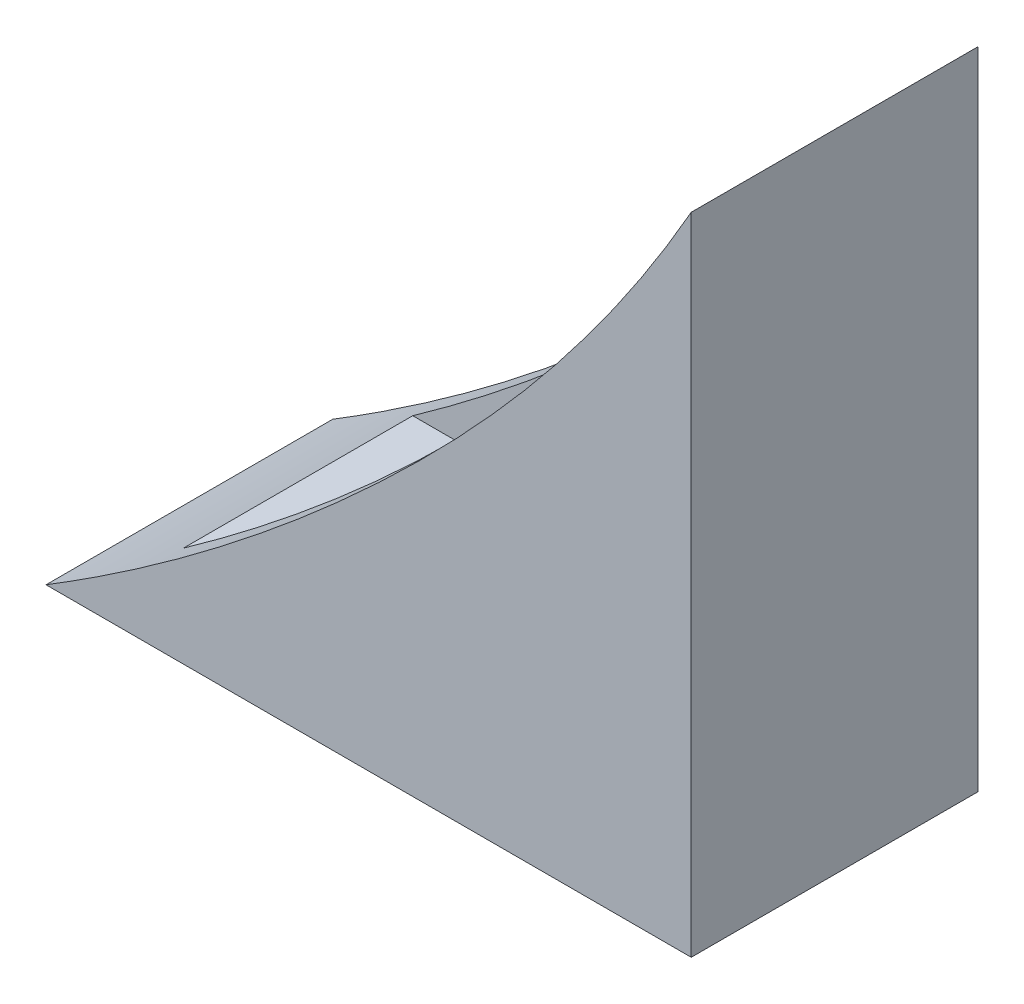
ISO-10303-21;
HEADER;
FILE_DESCRIPTION(('STEP AP214'),'2;1');
FILE_NAME('part.step','',(''),(''),'','','');
FILE_SCHEMA(('AUTOMOTIVE_DESIGN { 1 0 10303 214 1 1 1 1 }'));
ENDSEC;
DATA;
#1=APPLICATION_CONTEXT('core data for automotive mechanical design processes');
#2=APPLICATION_PROTOCOL_DEFINITION('international standard','automotive_design',2000,#1);
#3=PRODUCT_CONTEXT('',#1,'mechanical');
#4=PRODUCT('Part','Part','',(#3));
#5=PRODUCT_RELATED_PRODUCT_CATEGORY('part','',(#4));
#6=PRODUCT_DEFINITION_FORMATION('','',#4);
#7=PRODUCT_DEFINITION_CONTEXT('part definition',#1,'design');
#8=PRODUCT_DEFINITION('design','',#6,#7);
#9=PRODUCT_DEFINITION_SHAPE('','',#8);
#10=(LENGTH_UNIT() NAMED_UNIT(*) SI_UNIT(.MILLI.,.METRE.));
#11=(NAMED_UNIT(*) PLANE_ANGLE_UNIT() SI_UNIT($,.RADIAN.));
#12=(NAMED_UNIT(*) SI_UNIT($,.STERADIAN.) SOLID_ANGLE_UNIT());
#13=UNCERTAINTY_MEASURE_WITH_UNIT(LENGTH_MEASURE(1.E-05),#10,'distance_accuracy_value','');
#14=(GEOMETRIC_REPRESENTATION_CONTEXT(3) GLOBAL_UNCERTAINTY_ASSIGNED_CONTEXT((#13)) GLOBAL_UNIT_ASSIGNED_CONTEXT((#10,
#11,#12)) REPRESENTATION_CONTEXT('',''));
#15=CARTESIAN_POINT('',(0.,0.,0.));
#16=DIRECTION('',(0.,0.,1.));
#17=DIRECTION('',(1.,0.,0.));
#18=AXIS2_PLACEMENT_3D('',#15,#16,#17);
#19=CARTESIAN_POINT('',(-45.,0.,20.));
#20=DIRECTION('',(0.,1.,0.));
#21=DIRECTION('',(0.,0.,1.));
#22=AXIS2_PLACEMENT_3D('',#19,#20,#21);
#23=PLANE('',#22);
#24=DIRECTION('',(1.,0.,0.));
#25=VECTOR('',#24,1.);
#26=CARTESIAN_POINT('',(-45.,0.,0.));
#27=LINE('',#26,#25);
#28=CARTESIAN_POINT('',(-45.,0.,0.));
#29=VERTEX_POINT('',#28);
#30=CARTESIAN_POINT('',(0.,0.,0.));
#31=VERTEX_POINT('',#30);
#32=EDGE_CURVE('E120',#29,#31,#27,.T.);
#33=ORIENTED_EDGE('',*,*,#32,.T.);
#34=DIRECTION('',(0.,0.,-1.));
#35=VECTOR('',#34,1.);
#36=CARTESIAN_POINT('',(0.,0.,20.));
#37=LINE('',#36,#35);
#38=CARTESIAN_POINT('',(0.,0.,20.));
#39=VERTEX_POINT('',#38);
#40=EDGE_CURVE('E151',#39,#31,#37,.T.);
#41=ORIENTED_EDGE('',*,*,#40,.F.);
#42=DIRECTION('',(1.,0.,0.));
#43=VECTOR('',#42,1.);
#44=CARTESIAN_POINT('',(-45.,0.,20.));
#45=LINE('',#44,#43);
#46=CARTESIAN_POINT('',(-45.,0.,20.));
#47=VERTEX_POINT('',#46);
#48=EDGE_CURVE('E122',#47,#39,#45,.T.);
#49=ORIENTED_EDGE('',*,*,#48,.F.);
#50=DIRECTION('',(0.,0.,-1.));
#51=VECTOR('',#50,1.);
#52=CARTESIAN_POINT('',(-45.,0.,20.));
#53=LINE('',#52,#51);
#54=EDGE_CURVE('E129',#47,#29,#53,.T.);
#55=ORIENTED_EDGE('',*,*,#54,.T.);
#56=EDGE_LOOP('',(#33,#41,#49,#55));
#57=FACE_BOUND('',#56,.T.);
#58=ADVANCED_FACE('F35',(#57),#23,.F.);
#59=CARTESIAN_POINT('',(0.,0.,20.));
#60=DIRECTION('',(-1.,0.,0.));
#61=DIRECTION('',(0.,0.,1.));
#62=AXIS2_PLACEMENT_3D('',#59,#60,#61);
#63=PLANE('',#62);
#64=DIRECTION('',(0.,1.,0.));
#65=VECTOR('',#64,1.);
#66=CARTESIAN_POINT('',(0.,0.,0.));
#67=LINE('',#66,#65);
#68=CARTESIAN_POINT('',(0.,45.,0.));
#69=VERTEX_POINT('',#68);
#70=EDGE_CURVE('E148',#31,#69,#67,.T.);
#71=ORIENTED_EDGE('',*,*,#70,.T.);
#72=DIRECTION('',(0.,0.,-1.));
#73=VECTOR('',#72,1.);
#74=CARTESIAN_POINT('',(0.,45.,20.));
#75=LINE('',#74,#73);
#76=CARTESIAN_POINT('',(0.,45.,20.));
#77=VERTEX_POINT('',#76);
#78=EDGE_CURVE('E149',#77,#69,#75,.T.);
#79=ORIENTED_EDGE('',*,*,#78,.F.);
#80=DIRECTION('',(0.,1.,0.));
#81=VECTOR('',#80,1.);
#82=CARTESIAN_POINT('',(0.,0.,20.));
#83=LINE('',#82,#81);
#84=EDGE_CURVE('E83',#39,#77,#83,.T.);
#85=ORIENTED_EDGE('',*,*,#84,.F.);
#86=ORIENTED_EDGE('',*,*,#40,.T.);
#87=EDGE_LOOP('',(#71,#79,#85,#86));
#88=FACE_BOUND('',#87,.T.);
#89=ADVANCED_FACE('F139',(#88),#63,.F.);
#90=CARTESIAN_POINT('',(0.,45.,20.));
#91=CARTESIAN_POINT('',(-6.04309053970218,34.3770329950193,20.));
#92=CARTESIAN_POINT('',(-19.5965553607295,18.2904740966961,20.));
#93=CARTESIAN_POINT('',(-36.7689542137888,5.04759812100556,20.));
#94=CARTESIAN_POINT('',(-45.,0.,20.));
#95=B_SPLINE_CURVE_WITH_KNOTS('',3,(#90,#91,#92,#93,#94),.UNSPECIFIED.,.F.,.F.,(4,1,4),(0.,
0.550000000000001,1.),.UNSPECIFIED.);
#96=DIRECTION('',(0.,0.,-1.));
#97=VECTOR('',#96,1.);
#98=SURFACE_OF_LINEAR_EXTRUSION('',#95,#97);
#99=DIRECTION('',(0.,0.,-1.));
#100=VECTOR('',#99,1.);
#101=CARTESIAN_POINT('',(-4.99999999999907,37.0497521542313,20.));
#102=LINE('',#101,#100);
#103=CARTESIAN_POINT('',(-5.,37.0497521550673,2.));
#104=VERTEX_POINT('',#103);
#105=CARTESIAN_POINT('',(-5.,37.0497521542313,18.));
#106=VERTEX_POINT('',#105);
#107=EDGE_CURVE('E44',#104,#106,#102,.F.);
#108=ORIENTED_EDGE('',*,*,#107,.T.);
#109=CARTESIAN_POINT('',(0.,45.,18.));
#110=CARTESIAN_POINT('',(-6.04309053970218,34.3770329950193,18.));
#111=CARTESIAN_POINT('',(-19.5965553607295,18.2904740966961,18.));
#112=CARTESIAN_POINT('',(-36.7689542137888,5.04759812100556,18.));
#113=CARTESIAN_POINT('',(-45.,0.,18.));
#114=B_SPLINE_CURVE_WITH_KNOTS('',3,(#109,#110,#111,#112,#113),.UNSPECIFIED.,.F.,.F.,(4,1,4),
(0.,0.550000000000001,1.),.UNSPECIFIED.);
#115=CARTESIAN_POINT('',(-37.4223086144404,5.,18.));
#116=VERTEX_POINT('',#115);
#117=EDGE_CURVE('E11',#106,#116,#114,.T.);
#118=ORIENTED_EDGE('',*,*,#117,.T.);
#119=DIRECTION('',(0.,0.,-1.));
#120=VECTOR('',#119,1.);
#121=CARTESIAN_POINT('',(-37.4223086144404,5.,20.));
#122=LINE('',#121,#120);
#123=CARTESIAN_POINT('',(-37.4223086144404,5.,2.));
#124=VERTEX_POINT('',#123);
#125=EDGE_CURVE('E165',#124,#116,#122,.F.);
#126=ORIENTED_EDGE('',*,*,#125,.F.);
#127=CARTESIAN_POINT('',(0.,45.,2.));
#128=CARTESIAN_POINT('',(-6.04309053970218,34.3770329950193,2.));
#129=CARTESIAN_POINT('',(-19.5965553607295,18.2904740966961,2.));
#130=CARTESIAN_POINT('',(-36.7689542137888,5.04759812100556,2.));
#131=CARTESIAN_POINT('',(-45.,0.,2.));
#132=B_SPLINE_CURVE_WITH_KNOTS('',3,(#127,#128,#129,#130,#131),.UNSPECIFIED.,.F.,.F.,(4,1,4),
(0.,0.550000000000001,1.),.UNSPECIFIED.);
#133=EDGE_CURVE('E112',#124,#104,#132,.F.);
#134=ORIENTED_EDGE('',*,*,#133,.T.);
#135=EDGE_LOOP('',(#108,#118,#126,#134));
#136=FACE_BOUND('',#135,.T.);
#137=CARTESIAN_POINT('',(0.,45.,0.));
#138=CARTESIAN_POINT('',(-6.04309053970218,34.3770329950193,0.));
#139=CARTESIAN_POINT('',(-19.5965553607295,18.2904740966961,0.));
#140=CARTESIAN_POINT('',(-36.7689542137888,5.04759812100556,0.));
#141=CARTESIAN_POINT('',(-45.,0.,0.));
#142=B_SPLINE_CURVE_WITH_KNOTS('',3,(#137,#138,#139,#140,#141),.UNSPECIFIED.,.F.,.F.,(4,1,4),
(0.,0.550000000000001,1.),.UNSPECIFIED.);
#143=EDGE_CURVE('E77',#69,#29,#142,.T.);
#144=ORIENTED_EDGE('',*,*,#143,.T.);
#145=ORIENTED_EDGE('',*,*,#54,.F.);
#146=EDGE_CURVE('E60',#77,#47,#95,.T.);
#147=ORIENTED_EDGE('',*,*,#146,.F.);
#148=ORIENTED_EDGE('',*,*,#78,.T.);
#149=EDGE_LOOP('',(#144,#145,#147,#148));
#150=FACE_BOUND('',#149,.T.);
#151=ADVANCED_FACE('F135',(#136,#150),#98,.F.);
#152=CARTESIAN_POINT('',(-19.7424274688904,19.7424274688905,20.));
#153=DIRECTION('',(0.,0.,1.));
#154=DIRECTION('',(1.,0.,0.));
#155=AXIS2_PLACEMENT_3D('',#152,#153,#154);
#156=PLANE('',#155);
#157=ORIENTED_EDGE('',*,*,#48,.T.);
#158=ORIENTED_EDGE('',*,*,#84,.T.);
#159=ORIENTED_EDGE('',*,*,#146,.T.);
#160=EDGE_LOOP('',(#157,#158,#159));
#161=FACE_BOUND('',#160,.T.);
#162=ADVANCED_FACE('F138',(#161),#156,.T.);
#163=CARTESIAN_POINT('',(-19.7424274688904,19.7424274688905,0.));
#164=DIRECTION('',(0.,0.,1.));
#165=DIRECTION('',(1.,0.,0.));
#166=AXIS2_PLACEMENT_3D('',#163,#164,#165);
#167=PLANE('',#166);
#168=ORIENTED_EDGE('',*,*,#32,.F.);
#169=ORIENTED_EDGE('',*,*,#143,.F.);
#170=ORIENTED_EDGE('',*,*,#70,.F.);
#171=EDGE_LOOP('',(#168,#169,#170));
#172=FACE_BOUND('',#171,.T.);
#173=ADVANCED_FACE('F141',(#172),#167,.F.);
#174=CARTESIAN_POINT('',(-45.,45.,18.));
#175=DIRECTION('',(0.,0.,1.));
#176=DIRECTION('',(1.,0.,0.));
#177=AXIS2_PLACEMENT_3D('',#174,#175,#176);
#178=PLANE('',#177);
#179=DIRECTION('',(0.,-1.,0.));
#180=VECTOR('',#179,1.);
#181=CARTESIAN_POINT('',(-5.,45.,18.));
#182=LINE('',#181,#180);
#183=CARTESIAN_POINT('',(-5.,5.,18.));
#184=VERTEX_POINT('',#183);
#185=EDGE_CURVE('E108',#106,#184,#182,.T.);
#186=ORIENTED_EDGE('',*,*,#185,.T.);
#187=DIRECTION('',(-1.,0.,0.));
#188=VECTOR('',#187,1.);
#189=CARTESIAN_POINT('',(-45.,5.,18.));
#190=LINE('',#189,#188);
#191=EDGE_CURVE('E109',#184,#116,#190,.T.);
#192=ORIENTED_EDGE('',*,*,#191,.T.);
#193=ORIENTED_EDGE('',*,*,#117,.F.);
#194=EDGE_LOOP('',(#186,#192,#193));
#195=FACE_BOUND('',#194,.T.);
#196=ADVANCED_FACE('F173',(#195),#178,.F.);
#197=CARTESIAN_POINT('',(-5.,45.,2.));
#198=DIRECTION('',(1.,0.,0.));
#199=DIRECTION('',(0.,0.,-1.));
#200=AXIS2_PLACEMENT_3D('',#197,#198,#199);
#201=PLANE('',#200);
#202=DIRECTION('',(0.,-1.,0.));
#203=VECTOR('',#202,1.);
#204=CARTESIAN_POINT('',(-5.,45.,2.));
#205=LINE('',#204,#203);
#206=CARTESIAN_POINT('',(-5.,5.,2.));
#207=VERTEX_POINT('',#206);
#208=EDGE_CURVE('E100',#104,#207,#205,.T.);
#209=ORIENTED_EDGE('',*,*,#208,.T.);
#210=DIRECTION('',(0.,0.,1.));
#211=VECTOR('',#210,1.);
#212=CARTESIAN_POINT('',(-5.,5.,2.));
#213=LINE('',#212,#211);
#214=EDGE_CURVE('E103',#207,#184,#213,.T.);
#215=ORIENTED_EDGE('',*,*,#214,.T.);
#216=ORIENTED_EDGE('',*,*,#185,.F.);
#217=ORIENTED_EDGE('',*,*,#107,.F.);
#218=EDGE_LOOP('',(#209,#215,#216,#217));
#219=FACE_BOUND('',#218,.T.);
#220=ADVANCED_FACE('F101',(#219),#201,.F.);
#221=CARTESIAN_POINT('',(-45.,45.,2.));
#222=DIRECTION('',(0.,0.,-1.));
#223=DIRECTION('',(-1.,0.,0.));
#224=AXIS2_PLACEMENT_3D('',#221,#222,#223);
#225=PLANE('',#224);
#226=DIRECTION('',(1.,0.,0.));
#227=VECTOR('',#226,1.);
#228=CARTESIAN_POINT('',(-45.,5.,2.));
#229=LINE('',#228,#227);
#230=EDGE_CURVE('E51',#124,#207,#229,.T.);
#231=ORIENTED_EDGE('',*,*,#230,.T.);
#232=ORIENTED_EDGE('',*,*,#208,.F.);
#233=ORIENTED_EDGE('',*,*,#133,.F.);
#234=EDGE_LOOP('',(#231,#232,#233));
#235=FACE_BOUND('',#234,.T.);
#236=ADVANCED_FACE('F111',(#235),#225,.F.);
#237=CARTESIAN_POINT('',(0.,5.,0.));
#238=DIRECTION('',(0.,1.,0.));
#239=DIRECTION('',(0.,0.,1.));
#240=AXIS2_PLACEMENT_3D('',#237,#238,#239);
#241=PLANE('',#240);
#242=ORIENTED_EDGE('',*,*,#125,.T.);
#243=ORIENTED_EDGE('',*,*,#191,.F.);
#244=ORIENTED_EDGE('',*,*,#214,.F.);
#245=ORIENTED_EDGE('',*,*,#230,.F.);
#246=EDGE_LOOP('',(#242,#243,#244,#245));
#247=FACE_BOUND('',#246,.T.);
#248=ADVANCED_FACE('F115',(#247),#241,.T.);
#249=CLOSED_SHELL('',(#58,#89,#151,#162,#173,#196,#220,#236,#248));
#250=MANIFOLD_SOLID_BREP('B2',#249);
#251=ADVANCED_BREP_SHAPE_REPRESENTATION('',(#18,#250),#14);
#252=SHAPE_DEFINITION_REPRESENTATION(#9,#251);
ENDSEC;
END-ISO-10303-21;
